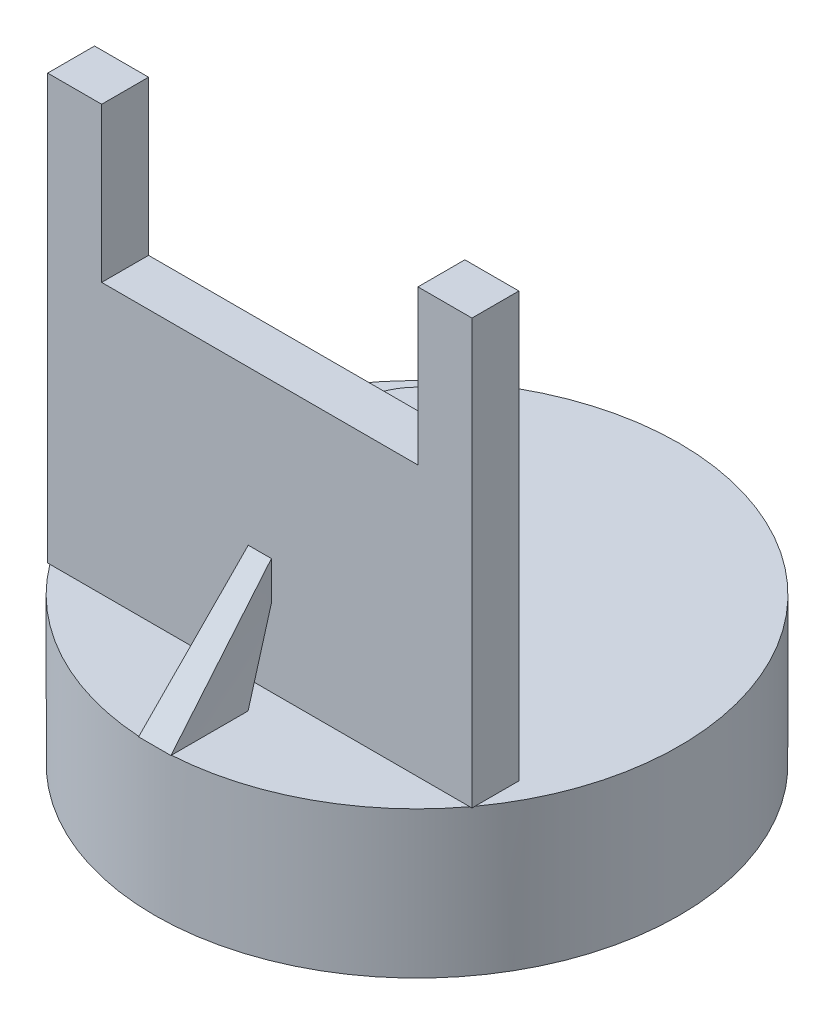
ISO-10303-21;
HEADER;
FILE_DESCRIPTION(('STEP AP214'),'2;1');
FILE_NAME('part.step','',(''),(''),'','','');
FILE_SCHEMA(('AUTOMOTIVE_DESIGN { 1 0 10303 214 1 1 1 1 }'));
ENDSEC;
DATA;
#1=APPLICATION_CONTEXT('core data for automotive mechanical design processes');
#2=APPLICATION_PROTOCOL_DEFINITION('international standard','automotive_design',2000,#1);
#3=PRODUCT_CONTEXT('',#1,'mechanical');
#4=PRODUCT('Part','Part','',(#3));
#5=PRODUCT_RELATED_PRODUCT_CATEGORY('part','',(#4));
#6=PRODUCT_DEFINITION_FORMATION('','',#4);
#7=PRODUCT_DEFINITION_CONTEXT('part definition',#1,'design');
#8=PRODUCT_DEFINITION('design','',#6,#7);
#9=PRODUCT_DEFINITION_SHAPE('','',#8);
#10=(LENGTH_UNIT() NAMED_UNIT(*) SI_UNIT(.MILLI.,.METRE.));
#11=(NAMED_UNIT(*) PLANE_ANGLE_UNIT() SI_UNIT($,.RADIAN.));
#12=(NAMED_UNIT(*) SI_UNIT($,.STERADIAN.) SOLID_ANGLE_UNIT());
#13=UNCERTAINTY_MEASURE_WITH_UNIT(LENGTH_MEASURE(1.E-05),#10,'distance_accuracy_value','');
#14=(GEOMETRIC_REPRESENTATION_CONTEXT(3) GLOBAL_UNCERTAINTY_ASSIGNED_CONTEXT((#13)) GLOBAL_UNIT_ASSIGNED_CONTEXT((#10,
#11,#12)) REPRESENTATION_CONTEXT('',''));
#15=CARTESIAN_POINT('',(0.,0.,0.));
#16=DIRECTION('',(0.,0.,1.));
#17=DIRECTION('',(1.,0.,0.));
#18=AXIS2_PLACEMENT_3D('',#15,#16,#17);
#19=CARTESIAN_POINT('',(0.,4.,-34.));
#20=DIRECTION('',(0.,1.,0.));
#21=DIRECTION('',(0.,0.,1.));
#22=AXIS2_PLACEMENT_3D('',#19,#20,#21);
#23=PLANE('',#22);
#24=DIRECTION('',(-1.,0.,0.));
#25=VECTOR('',#24,1.);
#26=CARTESIAN_POINT('',(-2.09692514172845,4.,24.));
#27=LINE('',#26,#25);
#28=CARTESIAN_POINT('',(2.09692514172843,4.,24.));
#29=VERTEX_POINT('',#28);
#30=CARTESIAN_POINT('',(-2.09692514172845,4.,24.));
#31=VERTEX_POINT('',#30);
#32=EDGE_CURVE('E205',#29,#31,#27,.T.);
#33=ORIENTED_EDGE('',*,*,#32,.F.);
#34=DIRECTION('',(0.,0.,-1.));
#35=VECTOR('',#34,1.);
#36=CARTESIAN_POINT('',(2.09692514172843,4.,34.));
#37=LINE('',#36,#35);
#38=CARTESIAN_POINT('',(2.09692514172843,4.,33.9352752302083));
#39=VERTEX_POINT('',#38);
#40=EDGE_CURVE('E505',#39,#29,#37,.T.);
#41=ORIENTED_EDGE('',*,*,#40,.F.);
#42=CARTESIAN_POINT('',(0.,4.,0.));
#43=DIRECTION('',(0.,-1.,0.));
#44=DIRECTION('',(0.,0.,-1.));
#45=AXIS2_PLACEMENT_3D('',#42,#43,#44);
#46=CIRCLE('',#45,34.);
#47=CARTESIAN_POINT('',(27.2158565918549,4.,20.3788407416022));
#48=VERTEX_POINT('',#47);
#49=EDGE_CURVE('E343',#48,#39,#46,.T.);
#50=ORIENTED_EDGE('',*,*,#49,.F.);
#51=DIRECTION('',(1.,0.,0.));
#52=VECTOR('',#51,1.);
#53=CARTESIAN_POINT('',(-27.5,4.,20.3788407416022));
#54=LINE('',#53,#52);
#55=CARTESIAN_POINT('',(-27.2158565918549,4.,20.3788407416022));
#56=VERTEX_POINT('',#55);
#57=EDGE_CURVE('E446',#56,#48,#54,.T.);
#58=ORIENTED_EDGE('',*,*,#57,.F.);
#59=CARTESIAN_POINT('',(-2.09692514172845,4.,33.9352752302083));
#60=VERTEX_POINT('',#59);
#61=EDGE_CURVE('E228',#60,#56,#46,.T.);
#62=ORIENTED_EDGE('',*,*,#61,.F.);
#63=DIRECTION('',(0.,0.,1.));
#64=VECTOR('',#63,1.);
#65=CARTESIAN_POINT('',(-2.09692514172845,4.,34.));
#66=LINE('',#65,#64);
#67=EDGE_CURVE('E216',#31,#60,#66,.T.);
#68=ORIENTED_EDGE('',*,*,#67,.F.);
#69=EDGE_LOOP('',(#33,#41,#50,#58,#62,#68));
#70=FACE_BOUND('',#69,.T.);
#71=ADVANCED_FACE('F48',(#70),#23,.T.);
#72=CARTESIAN_POINT('',(0.,4.,0.));
#73=DIRECTION('',(0.,1.,0.));
#74=DIRECTION('',(0.,0.,1.));
#75=AXIS2_PLACEMENT_3D('',#72,#73,#74);
#76=CIRCLE('',#75,7.5);
#77=CARTESIAN_POINT('',(0.,4.,7.5));
#78=VERTEX_POINT('',#77);
#79=EDGE_CURVE('E369',#78,#78,#76,.T.);
#80=ORIENTED_EDGE('',*,*,#79,.F.);
#81=EDGE_LOOP('',(#80));
#82=FACE_BOUND('',#81,.T.);
#83=CARTESIAN_POINT('',(-27.5,4.,19.9937490231322));
#84=VERTEX_POINT('',#83);
#85=CARTESIAN_POINT('',(27.5,4.,19.9937490231322));
#86=VERTEX_POINT('',#85);
#87=EDGE_CURVE('E348',#84,#86,#46,.T.);
#88=ORIENTED_EDGE('',*,*,#87,.F.);
#89=DIRECTION('',(0.,0.,1.));
#90=VECTOR('',#89,1.);
#91=CARTESIAN_POINT('',(-27.5,4.,14.3009408712998));
#92=LINE('',#91,#90);
#93=CARTESIAN_POINT('',(-27.5,4.,14.3009408712998));
#94=VERTEX_POINT('',#93);
#95=EDGE_CURVE('E448',#94,#84,#92,.T.);
#96=ORIENTED_EDGE('',*,*,#95,.F.);
#97=DIRECTION('',(-1.,0.,0.));
#98=VECTOR('',#97,1.);
#99=CARTESIAN_POINT('',(-27.5,4.,14.3009408712998));
#100=LINE('',#99,#98);
#101=CARTESIAN_POINT('',(27.5,4.,14.3009408712998));
#102=VERTEX_POINT('',#101);
#103=EDGE_CURVE('E436',#102,#94,#100,.T.);
#104=ORIENTED_EDGE('',*,*,#103,.F.);
#105=DIRECTION('',(0.,0.,-1.));
#106=VECTOR('',#105,1.);
#107=CARTESIAN_POINT('',(27.5,4.,14.3009408712998));
#108=LINE('',#107,#106);
#109=EDGE_CURVE('E442',#86,#102,#108,.T.);
#110=ORIENTED_EDGE('',*,*,#109,.F.);
#111=EDGE_LOOP('',(#88,#96,#104,#110));
#112=FACE_BOUND('',#111,.T.);
#113=ADVANCED_FACE('F251',(#82,#112),#23,.T.);
#114=CARTESIAN_POINT('',(0.,0.,0.));
#115=DIRECTION('',(0.,-1.,0.));
#116=DIRECTION('',(0.,0.,-1.));
#117=AXIS2_PLACEMENT_3D('',#114,#115,#116);
#118=CYLINDRICAL_SURFACE('',#117,4.5);
#119=CARTESIAN_POINT('',(0.,0.999999999999997,0.));
#120=DIRECTION('',(0.,-1.,0.));
#121=DIRECTION('',(0.,0.,-1.));
#122=AXIS2_PLACEMENT_3D('',#119,#120,#121);
#123=CIRCLE('',#122,4.5);
#124=CARTESIAN_POINT('',(0.,0.999999999999997,-4.5));
#125=VERTEX_POINT('',#124);
#126=EDGE_CURVE('E276',#125,#125,#123,.T.);
#127=ORIENTED_EDGE('',*,*,#126,.T.);
#128=EDGE_LOOP('',(#127));
#129=FACE_BOUND('',#128,.T.);
#130=CARTESIAN_POINT('',(0.,10.,0.));
#131=DIRECTION('',(0.,1.,0.));
#132=DIRECTION('',(0.,0.,1.));
#133=AXIS2_PLACEMENT_3D('',#130,#131,#132);
#134=CIRCLE('',#133,4.5);
#135=CARTESIAN_POINT('',(-4.03112887414928,10.,-2.));
#136=VERTEX_POINT('',#135);
#137=CARTESIAN_POINT('',(-4.03112887414928,10.,2.));
#138=VERTEX_POINT('',#137);
#139=EDGE_CURVE('E385',#136,#138,#134,.T.);
#140=ORIENTED_EDGE('',*,*,#139,.T.);
#141=DIRECTION('',(0.,-1.,0.));
#142=VECTOR('',#141,1.);
#143=CARTESIAN_POINT('',(-4.03112887414928,0.,2.));
#144=LINE('',#143,#142);
#145=CARTESIAN_POINT('',(-4.03112887414928,12.,2.));
#146=VERTEX_POINT('',#145);
#147=EDGE_CURVE('E381',#138,#146,#144,.F.);
#148=ORIENTED_EDGE('',*,*,#147,.T.);
#149=CARTESIAN_POINT('',(0.,12.,0.));
#150=DIRECTION('',(0.,1.,0.));
#151=DIRECTION('',(0.,0.,1.));
#152=AXIS2_PLACEMENT_3D('',#149,#150,#151);
#153=CIRCLE('',#152,4.5);
#154=CARTESIAN_POINT('',(4.03112887414928,12.,2.));
#155=VERTEX_POINT('',#154);
#156=EDGE_CURVE('E375',#146,#155,#153,.T.);
#157=ORIENTED_EDGE('',*,*,#156,.T.);
#158=DIRECTION('',(0.,-1.,0.));
#159=VECTOR('',#158,1.);
#160=CARTESIAN_POINT('',(4.03112887414928,0.,2.));
#161=LINE('',#160,#159);
#162=CARTESIAN_POINT('',(4.03112887414928,10.,2.));
#163=VERTEX_POINT('',#162);
#164=EDGE_CURVE('E378',#155,#163,#161,.T.);
#165=ORIENTED_EDGE('',*,*,#164,.T.);
#166=CARTESIAN_POINT('',(4.03112887414928,10.,-2.));
#167=VERTEX_POINT('',#166);
#168=EDGE_CURVE('E384',#163,#167,#134,.T.);
#169=ORIENTED_EDGE('',*,*,#168,.T.);
#170=DIRECTION('',(0.,-1.,0.));
#171=VECTOR('',#170,1.);
#172=CARTESIAN_POINT('',(4.03112887414927,0.,-2.));
#173=LINE('',#172,#171);
#174=CARTESIAN_POINT('',(4.03112887414928,12.,-2.));
#175=VERTEX_POINT('',#174);
#176=EDGE_CURVE('E391',#167,#175,#173,.F.);
#177=ORIENTED_EDGE('',*,*,#176,.T.);
#178=CARTESIAN_POINT('',(-4.03112887414928,12.,-2.));
#179=VERTEX_POINT('',#178);
#180=EDGE_CURVE('E374',#175,#179,#153,.T.);
#181=ORIENTED_EDGE('',*,*,#180,.T.);
#182=DIRECTION('',(0.,-1.,0.));
#183=VECTOR('',#182,1.);
#184=CARTESIAN_POINT('',(-4.03112887414927,0.,-2.));
#185=LINE('',#184,#183);
#186=EDGE_CURVE('E388',#179,#136,#185,.T.);
#187=ORIENTED_EDGE('',*,*,#186,.T.);
#188=EDGE_LOOP('',(#140,#148,#157,#165,#169,#177,#181,#187));
#189=FACE_BOUND('',#188,.T.);
#190=ADVANCED_FACE('F254',(#129,#189),#118,.F.);
#191=CARTESIAN_POINT('',(0.,12.,0.));
#192=DIRECTION('',(0.,-1.,0.));
#193=DIRECTION('',(0.,0.,-1.));
#194=AXIS2_PLACEMENT_3D('',#191,#192,#193);
#195=CYLINDRICAL_SURFACE('',#194,7.5);
#196=DIRECTION('',(0.,-1.,0.));
#197=VECTOR('',#196,1.);
#198=CARTESIAN_POINT('',(-7.22841614740048,12.,-2.));
#199=LINE('',#198,#197);
#200=CARTESIAN_POINT('',(-7.22841614740048,12.,-2.));
#201=VERTEX_POINT('',#200);
#202=CARTESIAN_POINT('',(-7.22841614740048,10.,-2.));
#203=VERTEX_POINT('',#202);
#204=EDGE_CURVE('E291',#201,#203,#199,.T.);
#205=ORIENTED_EDGE('',*,*,#204,.F.);
#206=CARTESIAN_POINT('',(0.,12.,0.));
#207=DIRECTION('',(0.,1.,0.));
#208=DIRECTION('',(0.,0.,1.));
#209=AXIS2_PLACEMENT_3D('',#206,#207,#208);
#210=CIRCLE('',#209,7.5);
#211=CARTESIAN_POINT('',(-7.22841614740048,12.,2.));
#212=VERTEX_POINT('',#211);
#213=EDGE_CURVE('E414',#201,#212,#210,.T.);
#214=ORIENTED_EDGE('',*,*,#213,.T.);
#215=DIRECTION('',(0.,-1.,0.));
#216=VECTOR('',#215,1.);
#217=CARTESIAN_POINT('',(-7.22841614740048,12.,2.));
#218=LINE('',#217,#216);
#219=CARTESIAN_POINT('',(-7.22841614740048,10.,2.));
#220=VERTEX_POINT('',#219);
#221=EDGE_CURVE('E12',#220,#212,#218,.F.);
#222=ORIENTED_EDGE('',*,*,#221,.F.);
#223=CARTESIAN_POINT('',(0.,10.,0.));
#224=DIRECTION('',(0.,1.,0.));
#225=DIRECTION('',(0.,0.,1.));
#226=AXIS2_PLACEMENT_3D('',#223,#224,#225);
#227=CIRCLE('',#226,7.5);
#228=EDGE_CURVE('E58',#203,#220,#227,.T.);
#229=ORIENTED_EDGE('',*,*,#228,.F.);
#230=EDGE_LOOP('',(#205,#214,#222,#229));
#231=FACE_BOUND('',#230,.T.);
#232=ORIENTED_EDGE('',*,*,#79,.T.);
#233=EDGE_LOOP('',(#232));
#234=FACE_BOUND('',#233,.T.);
#235=CARTESIAN_POINT('',(7.22841614740048,12.,2.));
#236=VERTEX_POINT('',#235);
#237=CARTESIAN_POINT('',(7.22841614740048,12.,-2.));
#238=VERTEX_POINT('',#237);
#239=EDGE_CURVE('E411',#236,#238,#210,.T.);
#240=ORIENTED_EDGE('',*,*,#239,.T.);
#241=DIRECTION('',(0.,-1.,0.));
#242=VECTOR('',#241,1.);
#243=CARTESIAN_POINT('',(7.22841614740048,12.,-2.));
#244=LINE('',#243,#242);
#245=CARTESIAN_POINT('',(7.22841614740048,10.,-2.));
#246=VERTEX_POINT('',#245);
#247=EDGE_CURVE('E278',#246,#238,#244,.F.);
#248=ORIENTED_EDGE('',*,*,#247,.F.);
#249=CARTESIAN_POINT('',(7.22841614740048,10.,2.));
#250=VERTEX_POINT('',#249);
#251=EDGE_CURVE('E286',#250,#246,#227,.T.);
#252=ORIENTED_EDGE('',*,*,#251,.F.);
#253=DIRECTION('',(0.,-1.,0.));
#254=VECTOR('',#253,1.);
#255=CARTESIAN_POINT('',(7.22841614740048,12.,2.));
#256=LINE('',#255,#254);
#257=EDGE_CURVE('E289',#236,#250,#256,.T.);
#258=ORIENTED_EDGE('',*,*,#257,.F.);
#259=EDGE_LOOP('',(#240,#248,#252,#258));
#260=FACE_BOUND('',#259,.T.);
#261=CARTESIAN_POINT('',(0.,22.,0.));
#262=DIRECTION('',(0.,1.,0.));
#263=DIRECTION('',(0.,0.,1.));
#264=AXIS2_PLACEMENT_3D('',#261,#262,#263);
#265=CIRCLE('',#264,7.5);
#266=CARTESIAN_POINT('',(0.,22.,7.5));
#267=VERTEX_POINT('',#266);
#268=EDGE_CURVE('E410',#267,#267,#265,.T.);
#269=ORIENTED_EDGE('',*,*,#268,.F.);
#270=EDGE_LOOP('',(#269));
#271=FACE_BOUND('',#270,.T.);
#272=ADVANCED_FACE('F257',(#231,#234,#260,#271),#195,.T.);
#273=CARTESIAN_POINT('',(0.,0.,-31.));
#274=DIRECTION('',(0.,-1.,0.));
#275=DIRECTION('',(0.,0.,-1.));
#276=AXIS2_PLACEMENT_3D('',#273,#274,#275);
#277=PLANE('',#276);
#278=CARTESIAN_POINT('',(0.,0.,0.));
#279=DIRECTION('',(0.,-1.,0.));
#280=DIRECTION('',(0.,0.,-1.));
#281=AXIS2_PLACEMENT_3D('',#278,#279,#280);
#282=CIRCLE('',#281,31.);
#283=CARTESIAN_POINT('',(0.,0.,-31.));
#284=VERTEX_POINT('',#283);
#285=EDGE_CURVE('E365',#284,#284,#282,.T.);
#286=ORIENTED_EDGE('',*,*,#285,.T.);
#287=EDGE_LOOP('',(#286));
#288=FACE_BOUND('',#287,.T.);
#289=CARTESIAN_POINT('',(0.,0.,0.));
#290=DIRECTION('',(0.,-1.,0.));
#291=DIRECTION('',(0.,0.,-1.));
#292=AXIS2_PLACEMENT_3D('',#289,#290,#291);
#293=CIRCLE('',#292,28.);
#294=CARTESIAN_POINT('',(0.,0.,-28.));
#295=VERTEX_POINT('',#294);
#296=EDGE_CURVE('E272',#295,#295,#293,.T.);
#297=ORIENTED_EDGE('',*,*,#296,.F.);
#298=EDGE_LOOP('',(#297));
#299=FACE_BOUND('',#298,.T.);
#300=ADVANCED_FACE('F50',(#288,#299),#277,.T.);
#301=CARTESIAN_POINT('',(0.,0.,0.));
#302=DIRECTION('',(0.,-1.,0.));
#303=DIRECTION('',(0.,0.,-1.));
#304=AXIS2_PLACEMENT_3D('',#301,#302,#303);
#305=CYLINDRICAL_SURFACE('',#304,28.);
#306=ORIENTED_EDGE('',*,*,#296,.T.);
#307=EDGE_LOOP('',(#306));
#308=FACE_BOUND('',#307,.T.);
#309=CARTESIAN_POINT('',(0.,1.,0.));
#310=DIRECTION('',(0.,-1.,0.));
#311=DIRECTION('',(0.,0.,-1.));
#312=AXIS2_PLACEMENT_3D('',#309,#310,#311);
#313=CIRCLE('',#312,28.);
#314=CARTESIAN_POINT('',(0.,1.,-28.));
#315=VERTEX_POINT('',#314);
#316=EDGE_CURVE('E275',#315,#315,#313,.T.);
#317=ORIENTED_EDGE('',*,*,#316,.F.);
#318=EDGE_LOOP('',(#317));
#319=FACE_BOUND('',#318,.T.);
#320=ADVANCED_FACE('F261',(#308,#319),#305,.F.);
#321=CARTESIAN_POINT('',(0.,0.999999999999998,-28.));
#322=DIRECTION('',(0.,-1.,0.));
#323=DIRECTION('',(0.,0.,-1.));
#324=AXIS2_PLACEMENT_3D('',#321,#322,#323);
#325=PLANE('',#324);
#326=ORIENTED_EDGE('',*,*,#316,.T.);
#327=EDGE_LOOP('',(#326));
#328=FACE_BOUND('',#327,.T.);
#329=ORIENTED_EDGE('',*,*,#126,.F.);
#330=EDGE_LOOP('',(#329));
#331=FACE_BOUND('',#330,.T.);
#332=ADVANCED_FACE('F259',(#328,#331),#325,.T.);
#333=CARTESIAN_POINT('',(0.,0.,0.));
#334=DIRECTION('',(0.,-1.,0.));
#335=DIRECTION('',(0.,0.,-1.));
#336=AXIS2_PLACEMENT_3D('',#333,#334,#335);
#337=CYLINDRICAL_SURFACE('',#336,34.);
#338=EDGE_CURVE('E281',#86,#48,#46,.T.);
#339=ORIENTED_EDGE('',*,*,#338,.T.);
#340=ORIENTED_EDGE('',*,*,#49,.T.);
#341=CARTESIAN_POINT('',(0.,4.,34.));
#342=VERTEX_POINT('',#341);
#343=EDGE_CURVE('E335',#39,#342,#46,.T.);
#344=ORIENTED_EDGE('',*,*,#343,.T.);
#345=EDGE_CURVE('E344',#342,#60,#46,.T.);
#346=ORIENTED_EDGE('',*,*,#345,.T.);
#347=ORIENTED_EDGE('',*,*,#61,.T.);
#348=EDGE_CURVE('E349',#56,#84,#46,.T.);
#349=ORIENTED_EDGE('',*,*,#348,.T.);
#350=ORIENTED_EDGE('',*,*,#87,.T.);
#351=EDGE_LOOP('',(#339,#340,#344,#346,#347,#349,#350));
#352=FACE_BOUND('',#351,.T.);
#353=CARTESIAN_POINT('',(0.,-15.,0.));
#354=DIRECTION('',(0.,-1.,0.));
#355=DIRECTION('',(0.,0.,-1.));
#356=AXIS2_PLACEMENT_3D('',#353,#354,#355);
#357=CIRCLE('',#356,34.);
#358=CARTESIAN_POINT('',(0.,-15.,-34.));
#359=VERTEX_POINT('',#358);
#360=EDGE_CURVE('E350',#359,#359,#357,.T.);
#361=ORIENTED_EDGE('',*,*,#360,.F.);
#362=EDGE_LOOP('',(#361));
#363=FACE_BOUND('',#362,.T.);
#364=ADVANCED_FACE('F252',(#352,#363),#337,.T.);
#365=CARTESIAN_POINT('',(0.,-15.,-31.));
#366=DIRECTION('',(0.,-1.,0.));
#367=DIRECTION('',(0.,0.,-1.));
#368=AXIS2_PLACEMENT_3D('',#365,#366,#367);
#369=PLANE('',#368);
#370=ORIENTED_EDGE('',*,*,#360,.T.);
#371=EDGE_LOOP('',(#370));
#372=FACE_BOUND('',#371,.T.);
#373=CARTESIAN_POINT('',(0.,-15.,0.));
#374=DIRECTION('',(0.,-1.,0.));
#375=DIRECTION('',(0.,0.,-1.));
#376=AXIS2_PLACEMENT_3D('',#373,#374,#375);
#377=CIRCLE('',#376,31.);
#378=CARTESIAN_POINT('',(0.,-15.,-31.));
#379=VERTEX_POINT('',#378);
#380=EDGE_CURVE('E361',#379,#379,#377,.T.);
#381=ORIENTED_EDGE('',*,*,#380,.F.);
#382=EDGE_LOOP('',(#381));
#383=FACE_BOUND('',#382,.T.);
#384=ADVANCED_FACE('F763',(#372,#383),#369,.T.);
#385=CARTESIAN_POINT('',(0.,0.,0.));
#386=DIRECTION('',(0.,-1.,0.));
#387=DIRECTION('',(0.,0.,-1.));
#388=AXIS2_PLACEMENT_3D('',#385,#386,#387);
#389=CYLINDRICAL_SURFACE('',#388,31.);
#390=ORIENTED_EDGE('',*,*,#380,.T.);
#391=EDGE_LOOP('',(#390));
#392=FACE_BOUND('',#391,.T.);
#393=ORIENTED_EDGE('',*,*,#285,.F.);
#394=EDGE_LOOP('',(#393));
#395=FACE_BOUND('',#394,.T.);
#396=ADVANCED_FACE('F937',(#392,#395),#389,.F.);
#397=CARTESIAN_POINT('',(19.,12.,-2.));
#398=DIRECTION('',(0.,0.,1.));
#399=DIRECTION('',(0.,-1.,0.));
#400=AXIS2_PLACEMENT_3D('',#397,#398,#399);
#401=PLANE('',#400);
#402=DIRECTION('',(-1.,0.,0.));
#403=VECTOR('',#402,1.);
#404=CARTESIAN_POINT('',(19.,10.,-2.));
#405=LINE('',#404,#403);
#406=EDGE_CURVE('E398',#246,#167,#405,.T.);
#407=ORIENTED_EDGE('',*,*,#406,.F.);
#408=ORIENTED_EDGE('',*,*,#247,.T.);
#409=DIRECTION('',(-1.,0.,0.));
#410=VECTOR('',#409,1.);
#411=CARTESIAN_POINT('',(19.,12.,-2.));
#412=LINE('',#411,#410);
#413=EDGE_CURVE('E402',#238,#175,#412,.T.);
#414=ORIENTED_EDGE('',*,*,#413,.T.);
#415=ORIENTED_EDGE('',*,*,#176,.F.);
#416=EDGE_LOOP('',(#407,#408,#414,#415));
#417=FACE_BOUND('',#416,.T.);
#418=ADVANCED_FACE('F905',(#417),#401,.T.);
#419=CARTESIAN_POINT('',(19.,10.,2.));
#420=DIRECTION('',(0.,1.,0.));
#421=DIRECTION('',(0.,0.,1.));
#422=AXIS2_PLACEMENT_3D('',#419,#420,#421);
#423=PLANE('',#422);
#424=DIRECTION('',(-1.,0.,0.));
#425=VECTOR('',#424,1.);
#426=CARTESIAN_POINT('',(19.,10.,2.));
#427=LINE('',#426,#425);
#428=EDGE_CURVE('E394',#250,#163,#427,.T.);
#429=ORIENTED_EDGE('',*,*,#428,.F.);
#430=ORIENTED_EDGE('',*,*,#251,.T.);
#431=ORIENTED_EDGE('',*,*,#406,.T.);
#432=ORIENTED_EDGE('',*,*,#168,.F.);
#433=EDGE_LOOP('',(#429,#430,#431,#432));
#434=FACE_BOUND('',#433,.T.);
#435=ADVANCED_FACE('F926',(#434),#423,.T.);
#436=CARTESIAN_POINT('',(19.,12.,2.));
#437=DIRECTION('',(0.,0.,-1.));
#438=DIRECTION('',(0.,1.,0.));
#439=AXIS2_PLACEMENT_3D('',#436,#437,#438);
#440=PLANE('',#439);
#441=DIRECTION('',(-1.,0.,0.));
#442=VECTOR('',#441,1.);
#443=CARTESIAN_POINT('',(19.,12.,2.));
#444=LINE('',#443,#442);
#445=EDGE_CURVE('E406',#236,#155,#444,.T.);
#446=ORIENTED_EDGE('',*,*,#445,.F.);
#447=ORIENTED_EDGE('',*,*,#257,.T.);
#448=ORIENTED_EDGE('',*,*,#428,.T.);
#449=ORIENTED_EDGE('',*,*,#164,.F.);
#450=EDGE_LOOP('',(#446,#447,#448,#449));
#451=FACE_BOUND('',#450,.T.);
#452=ADVANCED_FACE('F916',(#451),#440,.T.);
#453=EDGE_CURVE('E395',#138,#220,#427,.T.);
#454=ORIENTED_EDGE('',*,*,#453,.T.);
#455=ORIENTED_EDGE('',*,*,#221,.T.);
#456=EDGE_CURVE('E407',#146,#212,#444,.T.);
#457=ORIENTED_EDGE('',*,*,#456,.F.);
#458=ORIENTED_EDGE('',*,*,#147,.F.);
#459=EDGE_LOOP('',(#454,#455,#457,#458));
#460=FACE_BOUND('',#459,.T.);
#461=ADVANCED_FACE('F911',(#460),#440,.T.);
#462=EDGE_CURVE('E399',#136,#203,#405,.T.);
#463=ORIENTED_EDGE('',*,*,#462,.T.);
#464=ORIENTED_EDGE('',*,*,#228,.T.);
#465=ORIENTED_EDGE('',*,*,#453,.F.);
#466=ORIENTED_EDGE('',*,*,#139,.F.);
#467=EDGE_LOOP('',(#463,#464,#465,#466));
#468=FACE_BOUND('',#467,.T.);
#469=ADVANCED_FACE('F902',(#468),#423,.T.);
#470=EDGE_CURVE('E403',#179,#201,#412,.T.);
#471=ORIENTED_EDGE('',*,*,#470,.T.);
#472=ORIENTED_EDGE('',*,*,#204,.T.);
#473=ORIENTED_EDGE('',*,*,#462,.F.);
#474=ORIENTED_EDGE('',*,*,#186,.F.);
#475=EDGE_LOOP('',(#471,#472,#473,#474));
#476=FACE_BOUND('',#475,.T.);
#477=ADVANCED_FACE('F891',(#476),#401,.T.);
#478=CARTESIAN_POINT('',(0.,22.,0.));
#479=DIRECTION('',(0.,1.,0.));
#480=DIRECTION('',(0.,0.,1.));
#481=AXIS2_PLACEMENT_3D('',#478,#479,#480);
#482=PLANE('',#481);
#483=ORIENTED_EDGE('',*,*,#268,.T.);
#484=EDGE_LOOP('',(#483));
#485=FACE_BOUND('',#484,.T.);
#486=CARTESIAN_POINT('',(0.,22.,0.));
#487=DIRECTION('',(0.,1.,0.));
#488=DIRECTION('',(0.,0.,1.));
#489=AXIS2_PLACEMENT_3D('',#486,#487,#488);
#490=CIRCLE('',#489,2.5);
#491=CARTESIAN_POINT('',(0.,22.,2.5));
#492=VERTEX_POINT('',#491);
#493=EDGE_CURVE('E420',#492,#492,#490,.T.);
#494=ORIENTED_EDGE('',*,*,#493,.F.);
#495=EDGE_LOOP('',(#494));
#496=FACE_BOUND('',#495,.T.);
#497=ADVANCED_FACE('F881',(#485,#496),#482,.T.);
#498=CARTESIAN_POINT('',(0.,12.,0.));
#499=DIRECTION('',(0.,1.,0.));
#500=DIRECTION('',(0.,0.,1.));
#501=AXIS2_PLACEMENT_3D('',#498,#499,#500);
#502=PLANE('',#501);
#503=ORIENTED_EDGE('',*,*,#445,.T.);
#504=ORIENTED_EDGE('',*,*,#156,.F.);
#505=ORIENTED_EDGE('',*,*,#456,.T.);
#506=ORIENTED_EDGE('',*,*,#213,.F.);
#507=ORIENTED_EDGE('',*,*,#470,.F.);
#508=ORIENTED_EDGE('',*,*,#180,.F.);
#509=ORIENTED_EDGE('',*,*,#413,.F.);
#510=ORIENTED_EDGE('',*,*,#239,.F.);
#511=EDGE_LOOP('',(#503,#504,#505,#506,#507,#508,#509,#510));
#512=FACE_BOUND('',#511,.T.);
#513=CARTESIAN_POINT('',(0.,12.,0.));
#514=DIRECTION('',(0.,1.,0.));
#515=DIRECTION('',(0.,0.,1.));
#516=AXIS2_PLACEMENT_3D('',#513,#514,#515);
#517=CIRCLE('',#516,2.5);
#518=CARTESIAN_POINT('',(0.,12.,2.5));
#519=VERTEX_POINT('',#518);
#520=EDGE_CURVE('E417',#519,#519,#517,.T.);
#521=ORIENTED_EDGE('',*,*,#520,.T.);
#522=EDGE_LOOP('',(#521));
#523=FACE_BOUND('',#522,.T.);
#524=ADVANCED_FACE('F686',(#512,#523),#502,.F.);
#525=CARTESIAN_POINT('',(0.,22.,0.));
#526=DIRECTION('',(0.,-1.,0.));
#527=DIRECTION('',(0.,0.,-1.));
#528=AXIS2_PLACEMENT_3D('',#525,#526,#527);
#529=CYLINDRICAL_SURFACE('',#528,2.5);
#530=ORIENTED_EDGE('',*,*,#493,.T.);
#531=EDGE_LOOP('',(#530));
#532=FACE_BOUND('',#531,.T.);
#533=ORIENTED_EDGE('',*,*,#520,.F.);
#534=EDGE_LOOP('',(#533));
#535=FACE_BOUND('',#534,.T.);
#536=ADVANCED_FACE('F680',(#532,#535),#529,.F.);
#537=CARTESIAN_POINT('',(0.,4.,0.));
#538=DIRECTION('',(0.,1.,0.));
#539=DIRECTION('',(0.,0.,1.));
#540=AXIS2_PLACEMENT_3D('',#537,#538,#539);
#541=PLANE('',#540);
#542=ORIENTED_EDGE('',*,*,#348,.F.);
#543=CARTESIAN_POINT('',(-27.5,4.,20.3788407416022));
#544=VERTEX_POINT('',#543);
#545=EDGE_CURVE('E443',#544,#56,#54,.T.);
#546=ORIENTED_EDGE('',*,*,#545,.F.);
#547=EDGE_CURVE('E451',#84,#544,#92,.T.);
#548=ORIENTED_EDGE('',*,*,#547,.F.);
#549=EDGE_LOOP('',(#542,#546,#548));
#550=FACE_BOUND('',#549,.T.);
#551=ADVANCED_FACE('F678',(#550),#541,.F.);
#552=CARTESIAN_POINT('',(-27.5,39.,14.3009408712998));
#553=DIRECTION('',(1.,0.,0.));
#554=DIRECTION('',(0.,0.,-1.));
#555=AXIS2_PLACEMENT_3D('',#552,#553,#554);
#556=PLANE('',#555);
#557=ORIENTED_EDGE('',*,*,#95,.T.);
#558=ORIENTED_EDGE('',*,*,#547,.T.);
#559=DIRECTION('',(0.,-1.,0.));
#560=VECTOR('',#559,1.);
#561=CARTESIAN_POINT('',(-27.5,39.,20.3788407416022));
#562=LINE('',#561,#560);
#563=CARTESIAN_POINT('',(-27.5,59.,20.3788407416022));
#564=VERTEX_POINT('',#563);
#565=EDGE_CURVE('E421',#564,#544,#562,.T.);
#566=ORIENTED_EDGE('',*,*,#565,.F.);
#567=DIRECTION('',(0.,0.,1.));
#568=VECTOR('',#567,1.);
#569=CARTESIAN_POINT('',(-27.5,59.,0.));
#570=LINE('',#569,#568);
#571=CARTESIAN_POINT('',(-27.5,59.,14.3009408712998));
#572=VERTEX_POINT('',#571);
#573=EDGE_CURVE('E486',#572,#564,#570,.T.);
#574=ORIENTED_EDGE('',*,*,#573,.F.);
#575=DIRECTION('',(0.,-1.,0.));
#576=VECTOR('',#575,1.);
#577=CARTESIAN_POINT('',(-27.5,39.,14.3009408712998));
#578=LINE('',#577,#576);
#579=EDGE_CURVE('E432',#572,#94,#578,.T.);
#580=ORIENTED_EDGE('',*,*,#579,.T.);
#581=EDGE_LOOP('',(#557,#558,#566,#574,#580));
#582=FACE_BOUND('',#581,.T.);
#583=ADVANCED_FACE('F312',(#582),#556,.F.);
#584=CARTESIAN_POINT('',(-27.5,39.,20.3788407416022));
#585=DIRECTION('',(0.,0.,-1.));
#586=DIRECTION('',(-1.,0.,0.));
#587=AXIS2_PLACEMENT_3D('',#584,#585,#586);
#588=PLANE('',#587);
#589=DIRECTION('',(1.,0.,0.));
#590=VECTOR('',#589,1.);
#591=CARTESIAN_POINT('',(1.5,14.,20.3788407416022));
#592=LINE('',#591,#590);
#593=CARTESIAN_POINT('',(-1.5,14.,20.3788407416022));
#594=VERTEX_POINT('',#593);
#595=CARTESIAN_POINT('',(1.5,14.,20.3788407416022));
#596=VERTEX_POINT('',#595);
#597=EDGE_CURVE('E239',#594,#596,#592,.T.);
#598=ORIENTED_EDGE('',*,*,#597,.F.);
#599=DIRECTION('',(0.,-1.,0.));
#600=VECTOR('',#599,1.);
#601=CARTESIAN_POINT('',(-1.5,14.,20.3788407416022));
#602=LINE('',#601,#600);
#603=CARTESIAN_POINT('',(-1.5,19.,20.3788407416022));
#604=VERTEX_POINT('',#603);
#605=EDGE_CURVE('E221',#604,#594,#602,.T.);
#606=ORIENTED_EDGE('',*,*,#605,.F.);
#607=DIRECTION('',(-1.,0.,0.));
#608=VECTOR('',#607,1.);
#609=CARTESIAN_POINT('',(1.5,19.,20.3788407416022));
#610=LINE('',#609,#608);
#611=CARTESIAN_POINT('',(1.5,19.,20.3788407416022));
#612=VERTEX_POINT('',#611);
#613=EDGE_CURVE('E499',#612,#604,#610,.T.);
#614=ORIENTED_EDGE('',*,*,#613,.F.);
#615=DIRECTION('',(0.,1.,0.));
#616=VECTOR('',#615,1.);
#617=CARTESIAN_POINT('',(1.5,14.,20.3788407416022));
#618=LINE('',#617,#616);
#619=EDGE_CURVE('E501',#596,#612,#618,.T.);
#620=ORIENTED_EDGE('',*,*,#619,.F.);
#621=EDGE_LOOP('',(#598,#606,#614,#620));
#622=FACE_BOUND('',#621,.T.);
#623=ORIENTED_EDGE('',*,*,#545,.T.);
#624=ORIENTED_EDGE('',*,*,#57,.T.);
#625=CARTESIAN_POINT('',(27.5,4.,20.3788407416022));
#626=VERTEX_POINT('',#625);
#627=EDGE_CURVE('E447',#48,#626,#54,.T.);
#628=ORIENTED_EDGE('',*,*,#627,.T.);
#629=DIRECTION('',(0.,-1.,0.));
#630=VECTOR('',#629,1.);
#631=CARTESIAN_POINT('',(27.5,39.,20.3788407416022));
#632=LINE('',#631,#630);
#633=CARTESIAN_POINT('',(27.5,59.,20.3788407416022));
#634=VERTEX_POINT('',#633);
#635=EDGE_CURVE('E426',#634,#626,#632,.T.);
#636=ORIENTED_EDGE('',*,*,#635,.F.);
#637=DIRECTION('',(1.,0.,0.));
#638=VECTOR('',#637,1.);
#639=CARTESIAN_POINT('',(0.,59.,20.3788407416022));
#640=LINE('',#639,#638);
#641=CARTESIAN_POINT('',(20.5,59.,20.3788407416022));
#642=VERTEX_POINT('',#641);
#643=EDGE_CURVE('E468',#642,#634,#640,.T.);
#644=ORIENTED_EDGE('',*,*,#643,.F.);
#645=DIRECTION('',(0.,-1.,0.));
#646=VECTOR('',#645,1.);
#647=CARTESIAN_POINT('',(20.5,59.,20.3788407416022));
#648=LINE('',#647,#646);
#649=CARTESIAN_POINT('',(20.5,39.,20.3788407416022));
#650=VERTEX_POINT('',#649);
#651=EDGE_CURVE('E457',#642,#650,#648,.T.);
#652=ORIENTED_EDGE('',*,*,#651,.T.);
#653=DIRECTION('',(1.,0.,0.));
#654=VECTOR('',#653,1.);
#655=CARTESIAN_POINT('',(-27.5,39.,20.3788407416022));
#656=LINE('',#655,#654);
#657=CARTESIAN_POINT('',(-20.5,39.,20.3788407416022));
#658=VERTEX_POINT('',#657);
#659=EDGE_CURVE('E438',#658,#650,#656,.T.);
#660=ORIENTED_EDGE('',*,*,#659,.F.);
#661=DIRECTION('',(0.,-1.,0.));
#662=VECTOR('',#661,1.);
#663=CARTESIAN_POINT('',(-20.5,59.,20.3788407416022));
#664=LINE('',#663,#662);
#665=CARTESIAN_POINT('',(-20.5,59.,20.3788407416022));
#666=VERTEX_POINT('',#665);
#667=EDGE_CURVE('E477',#666,#658,#664,.T.);
#668=ORIENTED_EDGE('',*,*,#667,.F.);
#669=DIRECTION('',(1.,0.,0.));
#670=VECTOR('',#669,1.);
#671=CARTESIAN_POINT('',(0.,59.,20.3788407416022));
#672=LINE('',#671,#670);
#673=EDGE_CURVE('E480',#564,#666,#672,.T.);
#674=ORIENTED_EDGE('',*,*,#673,.F.);
#675=ORIENTED_EDGE('',*,*,#565,.T.);
#676=EDGE_LOOP('',(#623,#624,#628,#636,#644,#652,#660,#668,#674,#675));
#677=FACE_BOUND('',#676,.T.);
#678=ADVANCED_FACE('F301',(#622,#677),#588,.F.);
#679=CARTESIAN_POINT('',(27.5,39.,14.3009408712998));
#680=DIRECTION('',(-1.,0.,0.));
#681=DIRECTION('',(0.,0.,1.));
#682=AXIS2_PLACEMENT_3D('',#679,#680,#681);
#683=PLANE('',#682);
#684=EDGE_CURVE('E439',#626,#86,#108,.T.);
#685=ORIENTED_EDGE('',*,*,#684,.T.);
#686=ORIENTED_EDGE('',*,*,#109,.T.);
#687=DIRECTION('',(0.,-1.,0.));
#688=VECTOR('',#687,1.);
#689=CARTESIAN_POINT('',(27.5,39.,14.3009408712998));
#690=LINE('',#689,#688);
#691=CARTESIAN_POINT('',(27.5,59.,14.3009408712998));
#692=VERTEX_POINT('',#691);
#693=EDGE_CURVE('E429',#692,#102,#690,.T.);
#694=ORIENTED_EDGE('',*,*,#693,.F.);
#695=DIRECTION('',(0.,0.,-1.));
#696=VECTOR('',#695,1.);
#697=CARTESIAN_POINT('',(27.5,59.,0.));
#698=LINE('',#697,#696);
#699=EDGE_CURVE('E460',#634,#692,#698,.T.);
#700=ORIENTED_EDGE('',*,*,#699,.F.);
#701=ORIENTED_EDGE('',*,*,#635,.T.);
#702=EDGE_LOOP('',(#685,#686,#694,#700,#701));
#703=FACE_BOUND('',#702,.T.);
#704=ADVANCED_FACE('F311',(#703),#683,.F.);
#705=CARTESIAN_POINT('',(-27.5,39.,14.3009408712998));
#706=DIRECTION('',(0.,0.,1.));
#707=DIRECTION('',(1.,0.,0.));
#708=AXIS2_PLACEMENT_3D('',#705,#706,#707);
#709=PLANE('',#708);
#710=ORIENTED_EDGE('',*,*,#103,.T.);
#711=ORIENTED_EDGE('',*,*,#579,.F.);
#712=DIRECTION('',(-1.,0.,0.));
#713=VECTOR('',#712,1.);
#714=CARTESIAN_POINT('',(0.,59.,14.3009408712998));
#715=LINE('',#714,#713);
#716=CARTESIAN_POINT('',(-20.5,59.,14.3009408712998));
#717=VERTEX_POINT('',#716);
#718=EDGE_CURVE('E489',#717,#572,#715,.T.);
#719=ORIENTED_EDGE('',*,*,#718,.F.);
#720=DIRECTION('',(0.,-1.,0.));
#721=VECTOR('',#720,1.);
#722=CARTESIAN_POINT('',(-20.5,59.,14.3009408712998));
#723=LINE('',#722,#721);
#724=CARTESIAN_POINT('',(-20.5,39.,14.3009408712998));
#725=VERTEX_POINT('',#724);
#726=EDGE_CURVE('E465',#717,#725,#723,.T.);
#727=ORIENTED_EDGE('',*,*,#726,.T.);
#728=DIRECTION('',(-1.,0.,0.));
#729=VECTOR('',#728,1.);
#730=CARTESIAN_POINT('',(-27.5,39.,14.3009408712998));
#731=LINE('',#730,#729);
#732=CARTESIAN_POINT('',(20.5,39.,14.3009408712998));
#733=VERTEX_POINT('',#732);
#734=EDGE_CURVE('E435',#733,#725,#731,.T.);
#735=ORIENTED_EDGE('',*,*,#734,.F.);
#736=DIRECTION('',(0.,-1.,0.));
#737=VECTOR('',#736,1.);
#738=CARTESIAN_POINT('',(20.5,59.,14.3009408712998));
#739=LINE('',#738,#737);
#740=CARTESIAN_POINT('',(20.5,59.,14.3009408712998));
#741=VERTEX_POINT('',#740);
#742=EDGE_CURVE('E454',#741,#733,#739,.T.);
#743=ORIENTED_EDGE('',*,*,#742,.F.);
#744=DIRECTION('',(-1.,0.,0.));
#745=VECTOR('',#744,1.);
#746=CARTESIAN_POINT('',(0.,59.,14.3009408712998));
#747=LINE('',#746,#745);
#748=EDGE_CURVE('E464',#692,#741,#747,.T.);
#749=ORIENTED_EDGE('',*,*,#748,.F.);
#750=ORIENTED_EDGE('',*,*,#693,.T.);
#751=EDGE_LOOP('',(#710,#711,#719,#727,#735,#743,#749,#750));
#752=FACE_BOUND('',#751,.T.);
#753=ADVANCED_FACE('F654',(#752),#709,.F.);
#754=CARTESIAN_POINT('',(0.,39.,0.));
#755=DIRECTION('',(0.,1.,0.));
#756=DIRECTION('',(0.,0.,1.));
#757=AXIS2_PLACEMENT_3D('',#754,#755,#756);
#758=PLANE('',#757);
#759=DIRECTION('',(0.,0.,1.));
#760=VECTOR('',#759,1.);
#761=CARTESIAN_POINT('',(-20.5,39.,0.));
#762=LINE('',#761,#760);
#763=EDGE_CURVE('E481',#725,#658,#762,.T.);
#764=ORIENTED_EDGE('',*,*,#763,.T.);
#765=ORIENTED_EDGE('',*,*,#659,.T.);
#766=DIRECTION('',(0.,0.,1.));
#767=VECTOR('',#766,1.);
#768=CARTESIAN_POINT('',(20.5,39.,0.));
#769=LINE('',#768,#767);
#770=EDGE_CURVE('E461',#733,#650,#769,.T.);
#771=ORIENTED_EDGE('',*,*,#770,.F.);
#772=ORIENTED_EDGE('',*,*,#734,.T.);
#773=EDGE_LOOP('',(#764,#765,#771,#772));
#774=FACE_BOUND('',#773,.T.);
#775=ADVANCED_FACE('F690',(#774),#758,.T.);
#776=ORIENTED_EDGE('',*,*,#338,.F.);
#777=ORIENTED_EDGE('',*,*,#684,.F.);
#778=ORIENTED_EDGE('',*,*,#627,.F.);
#779=EDGE_LOOP('',(#776,#777,#778));
#780=FACE_BOUND('',#779,.T.);
#781=ADVANCED_FACE('F646',(#780),#541,.F.);
#782=CARTESIAN_POINT('',(20.5,59.,0.));
#783=DIRECTION('',(1.,0.,0.));
#784=DIRECTION('',(0.,0.,-1.));
#785=AXIS2_PLACEMENT_3D('',#782,#783,#784);
#786=PLANE('',#785);
#787=ORIENTED_EDGE('',*,*,#770,.T.);
#788=ORIENTED_EDGE('',*,*,#651,.F.);
#789=DIRECTION('',(0.,0.,1.));
#790=VECTOR('',#789,1.);
#791=CARTESIAN_POINT('',(20.5,59.,0.));
#792=LINE('',#791,#790);
#793=EDGE_CURVE('E471',#741,#642,#792,.T.);
#794=ORIENTED_EDGE('',*,*,#793,.F.);
#795=ORIENTED_EDGE('',*,*,#742,.T.);
#796=EDGE_LOOP('',(#787,#788,#794,#795));
#797=FACE_BOUND('',#796,.T.);
#798=ADVANCED_FACE('F671',(#797),#786,.F.);
#799=CARTESIAN_POINT('',(0.,59.,0.));
#800=DIRECTION('',(0.,1.,0.));
#801=DIRECTION('',(0.,0.,1.));
#802=AXIS2_PLACEMENT_3D('',#799,#800,#801);
#803=PLANE('',#802);
#804=ORIENTED_EDGE('',*,*,#748,.T.);
#805=ORIENTED_EDGE('',*,*,#793,.T.);
#806=ORIENTED_EDGE('',*,*,#643,.T.);
#807=ORIENTED_EDGE('',*,*,#699,.T.);
#808=EDGE_LOOP('',(#804,#805,#806,#807));
#809=FACE_BOUND('',#808,.T.);
#810=ADVANCED_FACE('F675',(#809),#803,.T.);
#811=CARTESIAN_POINT('',(-20.5,59.,0.));
#812=DIRECTION('',(1.,0.,0.));
#813=DIRECTION('',(0.,0.,-1.));
#814=AXIS2_PLACEMENT_3D('',#811,#812,#813);
#815=PLANE('',#814);
#816=ORIENTED_EDGE('',*,*,#763,.F.);
#817=ORIENTED_EDGE('',*,*,#726,.F.);
#818=DIRECTION('',(0.,0.,1.));
#819=VECTOR('',#818,1.);
#820=CARTESIAN_POINT('',(-20.5,59.,0.));
#821=LINE('',#820,#819);
#822=EDGE_CURVE('E484',#717,#666,#821,.T.);
#823=ORIENTED_EDGE('',*,*,#822,.T.);
#824=ORIENTED_EDGE('',*,*,#667,.T.);
#825=EDGE_LOOP('',(#816,#817,#823,#824));
#826=FACE_BOUND('',#825,.T.);
#827=ADVANCED_FACE('F666',(#826),#815,.T.);
#828=CARTESIAN_POINT('',(0.,59.,0.));
#829=DIRECTION('',(0.,1.,0.));
#830=DIRECTION('',(0.,0.,1.));
#831=AXIS2_PLACEMENT_3D('',#828,#829,#830);
#832=PLANE('',#831);
#833=ORIENTED_EDGE('',*,*,#822,.F.);
#834=ORIENTED_EDGE('',*,*,#718,.T.);
#835=ORIENTED_EDGE('',*,*,#573,.T.);
#836=ORIENTED_EDGE('',*,*,#673,.T.);
#837=EDGE_LOOP('',(#833,#834,#835,#836));
#838=FACE_BOUND('',#837,.T.);
#839=ADVANCED_FACE('F542',(#838),#832,.T.);
#840=CARTESIAN_POINT('',(0.,4.,0.));
#841=DIRECTION('',(0.,-1.,0.));
#842=DIRECTION('',(0.,0.,-1.));
#843=AXIS2_PLACEMENT_3D('',#840,#841,#842);
#844=PLANE('',#843);
#845=ORIENTED_EDGE('',*,*,#343,.F.);
#846=CARTESIAN_POINT('',(2.09692514172843,4.,34.));
#847=VERTEX_POINT('',#846);
#848=EDGE_CURVE('E211',#847,#39,#37,.T.);
#849=ORIENTED_EDGE('',*,*,#848,.F.);
#850=DIRECTION('',(1.,0.,0.));
#851=VECTOR('',#850,1.);
#852=CARTESIAN_POINT('',(-2.09692514172845,4.,34.));
#853=LINE('',#852,#851);
#854=EDGE_CURVE('E230',#342,#847,#853,.T.);
#855=ORIENTED_EDGE('',*,*,#854,.F.);
#856=EDGE_LOOP('',(#845,#849,#855));
#857=FACE_BOUND('',#856,.T.);
#858=ADVANCED_FACE('F532',(#857),#844,.T.);
#859=ORIENTED_EDGE('',*,*,#345,.F.);
#860=CARTESIAN_POINT('',(-2.09692514172845,4.,34.));
#861=VERTEX_POINT('',#860);
#862=EDGE_CURVE('E52',#861,#342,#853,.T.);
#863=ORIENTED_EDGE('',*,*,#862,.F.);
#864=EDGE_CURVE('E210',#60,#861,#66,.T.);
#865=ORIENTED_EDGE('',*,*,#864,.F.);
#866=EDGE_LOOP('',(#859,#863,#865));
#867=FACE_BOUND('',#866,.T.);
#868=ADVANCED_FACE('F541',(#867),#844,.T.);
#869=CARTESIAN_POINT('',(-2.09692514172845,4.,24.));
#870=CARTESIAN_POINT('',(-1.5,14.,20.3788407416022));
#871=CARTESIAN_POINT('',(-2.09692514172845,4.,25.6666666666667));
#872=CARTESIAN_POINT('',(-1.5,14.8333333333332,20.3788407416022));
#873=CARTESIAN_POINT('',(-2.09692514172845,4.,27.3333333333334));
#874=CARTESIAN_POINT('',(-1.5,15.6666666666665,20.3788407416022));
#875=CARTESIAN_POINT('',(-2.09692514172845,4.,30.6666666666667));
#876=CARTESIAN_POINT('',(-1.5,17.3333333333332,20.3788407416022));
#877=CARTESIAN_POINT('',(-2.09692514172845,4.,32.3333333333333));
#878=CARTESIAN_POINT('',(-1.5,18.1666666666666,20.3788407416022));
#879=CARTESIAN_POINT('',(-2.09692514172845,4.,34.));
#880=CARTESIAN_POINT('',(-1.5,19.,20.3788407416022));
#881=B_SPLINE_SURFACE_WITH_KNOTS('',3,1,((#869,#870),(#871,#872),(#873,#874),(#875,#876),(#877,
#878),(#879,#880)),.UNSPECIFIED.,.F.,.F.,.F.,(4,2,4),(2,2),(0.,0.5,1.),(0.,1.),.UNSPECIFIED.);
#882=DIRECTION('',(0.0294480044627475,0.739992397810848,-0.67197028670568));
#883=VECTOR('',#882,1.);
#884=CARTESIAN_POINT('',(-1.79846257086422,11.5,27.1894203708011));
#885=LINE('',#884,#883);
#886=EDGE_CURVE('E224',#861,#604,#885,.T.);
#887=DIRECTION('',(-0.0560377951525837,-0.938774248816554,0.339945106264749));
#888=VECTOR('',#887,1.);
#889=CARTESIAN_POINT('',(-1.79846257086422,9.,22.1894203708011));
#890=LINE('',#889,#888);
#891=EDGE_CURVE('E71',#594,#31,#890,.T.);
#892=ORIENTED_EDGE('',*,*,#67,.T.);
#893=ORIENTED_EDGE('',*,*,#864,.T.);
#894=ORIENTED_EDGE('',*,*,#886,.T.);
#895=ORIENTED_EDGE('',*,*,#605,.T.);
#896=ORIENTED_EDGE('',*,*,#891,.T.);
#897=EDGE_LOOP('',(#892,#893,#894,#895,#896));
#898=FACE_BOUND('',#897,.T.);
#899=ADVANCED_FACE('F215',(#898),#881,.T.);
#900=CARTESIAN_POINT('',(0.,18.7290165128021,20.6249146906368));
#901=DIRECTION('',(0.,0.672261837606204,0.74031346178381));
#902=DIRECTION('',(0.,-0.74031346178381,0.672261837606205));
#903=AXIS2_PLACEMENT_3D('',#900,#901,#902);
#904=PLANE('',#903);
#905=DIRECTION('',(-0.0294480044627468,0.739992397810848,-0.67197028670568));
#906=VECTOR('',#905,1.);
#907=CARTESIAN_POINT('',(2.09692514172843,4.,34.));
#908=LINE('',#907,#906);
#909=EDGE_CURVE('E620',#847,#612,#908,.T.);
#910=ORIENTED_EDGE('',*,*,#909,.T.);
#911=ORIENTED_EDGE('',*,*,#613,.T.);
#912=ORIENTED_EDGE('',*,*,#886,.F.);
#913=ORIENTED_EDGE('',*,*,#862,.T.);
#914=ORIENTED_EDGE('',*,*,#854,.T.);
#915=EDGE_LOOP('',(#910,#911,#912,#913,#914));
#916=FACE_BOUND('',#915,.T.);
#917=ADVANCED_FACE('F549',(#916),#904,.T.);
#918=CARTESIAN_POINT('',(0.,8.14699525910105,22.4983069722975));
#919=DIRECTION('',(0.,-0.340480120320142,-0.940251715056549));
#920=DIRECTION('',(0.,0.940251715056549,-0.340480120320142));
#921=AXIS2_PLACEMENT_3D('',#918,#919,#920);
#922=PLANE('',#921);
#923=ORIENTED_EDGE('',*,*,#891,.F.);
#924=ORIENTED_EDGE('',*,*,#597,.T.);
#925=DIRECTION('',(-0.0560377951525824,0.938774248816554,-0.339945106264749));
#926=VECTOR('',#925,1.);
#927=CARTESIAN_POINT('',(1.79846257086422,9.,22.1894203708011));
#928=LINE('',#927,#926);
#929=EDGE_CURVE('E66',#29,#596,#928,.T.);
#930=ORIENTED_EDGE('',*,*,#929,.F.);
#931=ORIENTED_EDGE('',*,*,#32,.T.);
#932=EDGE_LOOP('',(#923,#924,#930,#931));
#933=FACE_BOUND('',#932,.T.);
#934=ADVANCED_FACE('F206',(#933),#922,.T.);
#935=CARTESIAN_POINT('',(2.09692514172843,4.,34.));
#936=CARTESIAN_POINT('',(1.5,19.,20.3788407416022));
#937=CARTESIAN_POINT('',(2.09692514172843,4.,32.3333333333333));
#938=CARTESIAN_POINT('',(1.5,18.1666666666667,20.3788407416022));
#939=CARTESIAN_POINT('',(2.09692514172843,4.,30.6666666666666));
#940=CARTESIAN_POINT('',(1.5,17.3333333333333,20.3788407416022));
#941=CARTESIAN_POINT('',(2.09692514172843,4.,27.3333333333333));
#942=CARTESIAN_POINT('',(1.5,15.6666666666667,20.3788407416022));
#943=CARTESIAN_POINT('',(2.09692514172843,4.,25.6666666666666));
#944=CARTESIAN_POINT('',(1.5,14.8333333333333,20.3788407416022));
#945=CARTESIAN_POINT('',(2.09692514172843,4.,24.));
#946=CARTESIAN_POINT('',(1.5,14.,20.3788407416022));
#947=B_SPLINE_SURFACE_WITH_KNOTS('',3,1,((#935,#936),(#937,#938),(#939,#940),(#941,#942),(#943,
#944),(#945,#946)),.UNSPECIFIED.,.F.,.F.,.F.,(4,2,4),(2,2),(0.,0.5,1.),(0.,1.),.UNSPECIFIED.);
#948=ORIENTED_EDGE('',*,*,#848,.T.);
#949=ORIENTED_EDGE('',*,*,#40,.T.);
#950=ORIENTED_EDGE('',*,*,#929,.T.);
#951=ORIENTED_EDGE('',*,*,#619,.T.);
#952=ORIENTED_EDGE('',*,*,#909,.F.);
#953=EDGE_LOOP('',(#948,#949,#950,#951,#952));
#954=FACE_BOUND('',#953,.T.);
#955=ADVANCED_FACE('F589',(#954),#947,.T.);
#956=CLOSED_SHELL('',(#71,#113,#190,#272,#300,#320,#332,#364,#384,#396,#418,#435,#452,#461,#469,
#477,#497,#524,#536,#551,#583,#678,#704,#753,#775,#781,#798,#810,#827,#839,#858,#868,#899,#917,
#934,#955));
#957=MANIFOLD_SOLID_BREP('B2',#956);
#958=ADVANCED_BREP_SHAPE_REPRESENTATION('',(#18,#957),#14);
#959=SHAPE_DEFINITION_REPRESENTATION(#9,#958);
ENDSEC;
END-ISO-10303-21;
